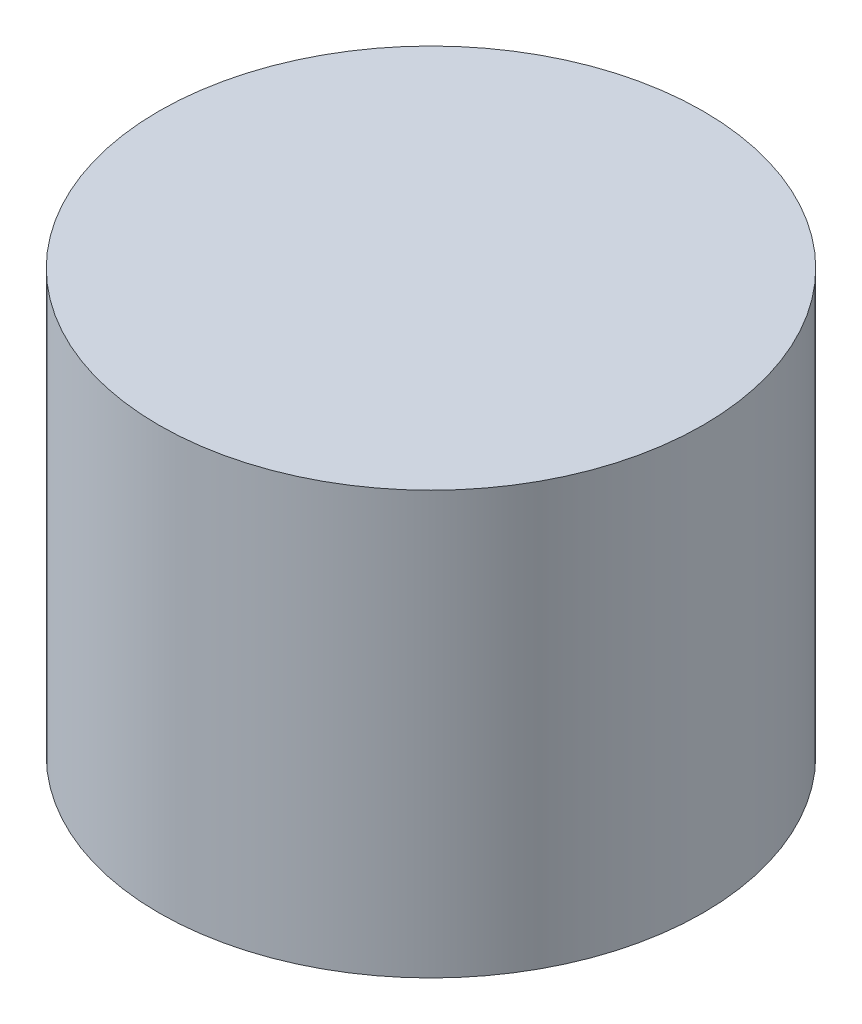
ISO-10303-21;
HEADER;
FILE_DESCRIPTION(('STEP AP214'),'2;1');
FILE_NAME('part.step','',(''),(''),'','','');
FILE_SCHEMA(('AUTOMOTIVE_DESIGN { 1 0 10303 214 1 1 1 1 }'));
ENDSEC;
DATA;
#1=APPLICATION_CONTEXT('core data for automotive mechanical design processes');
#2=APPLICATION_PROTOCOL_DEFINITION('international standard','automotive_design',2000,#1);
#3=PRODUCT_CONTEXT('',#1,'mechanical');
#4=PRODUCT('Part','Part','',(#3));
#5=PRODUCT_RELATED_PRODUCT_CATEGORY('part','',(#4));
#6=PRODUCT_DEFINITION_FORMATION('','',#4);
#7=PRODUCT_DEFINITION_CONTEXT('part definition',#1,'design');
#8=PRODUCT_DEFINITION('design','',#6,#7);
#9=PRODUCT_DEFINITION_SHAPE('','',#8);
#10=(LENGTH_UNIT() NAMED_UNIT(*) SI_UNIT(.MILLI.,.METRE.));
#11=(NAMED_UNIT(*) PLANE_ANGLE_UNIT() SI_UNIT($,.RADIAN.));
#12=(NAMED_UNIT(*) SI_UNIT($,.STERADIAN.) SOLID_ANGLE_UNIT());
#13=UNCERTAINTY_MEASURE_WITH_UNIT(LENGTH_MEASURE(1.E-05),#10,'distance_accuracy_value','');
#14=(GEOMETRIC_REPRESENTATION_CONTEXT(3) GLOBAL_UNCERTAINTY_ASSIGNED_CONTEXT((#13)) GLOBAL_UNIT_ASSIGNED_CONTEXT((#10,
#11,#12)) REPRESENTATION_CONTEXT('',''));
#15=CARTESIAN_POINT('',(0.,0.,0.));
#16=DIRECTION('',(0.,0.,1.));
#17=DIRECTION('',(1.,0.,0.));
#18=AXIS2_PLACEMENT_3D('',#15,#16,#17);
#19=CARTESIAN_POINT('',(0.,0.,0.));
#20=DIRECTION('',(0.,1.,0.));
#21=DIRECTION('',(0.,0.,1.));
#22=AXIS2_PLACEMENT_3D('',#19,#20,#21);
#23=CYLINDRICAL_SURFACE('',#22,1.9);
#24=CARTESIAN_POINT('',(0.,0.,0.));
#25=DIRECTION('',(0.,1.,0.));
#26=DIRECTION('',(0.,0.,1.));
#27=AXIS2_PLACEMENT_3D('',#24,#25,#26);
#28=CIRCLE('',#27,1.9);
#29=CARTESIAN_POINT('',(0.,0.,1.9));
#30=VERTEX_POINT('',#29);
#31=EDGE_CURVE('E10',#30,#30,#28,.T.);
#32=ORIENTED_EDGE('',*,*,#31,.T.);
#33=EDGE_LOOP('',(#32));
#34=FACE_BOUND('',#33,.T.);
#35=CARTESIAN_POINT('',(0.,2.95,0.));
#36=DIRECTION('',(0.,1.,0.));
#37=DIRECTION('',(0.,0.,1.));
#38=AXIS2_PLACEMENT_3D('',#35,#36,#37);
#39=CIRCLE('',#38,1.9);
#40=CARTESIAN_POINT('',(0.,2.95,1.9));
#41=VERTEX_POINT('',#40);
#42=EDGE_CURVE('E41',#41,#41,#39,.T.);
#43=ORIENTED_EDGE('',*,*,#42,.F.);
#44=EDGE_LOOP('',(#43));
#45=FACE_BOUND('',#44,.T.);
#46=ADVANCED_FACE('F35',(#34,#45),#23,.T.);
#47=CARTESIAN_POINT('',(1.9,0.,0.));
#48=DIRECTION('',(0.,-1.,0.));
#49=DIRECTION('',(0.,0.,-1.));
#50=AXIS2_PLACEMENT_3D('',#47,#48,#49);
#51=PLANE('',#50);
#52=ORIENTED_EDGE('',*,*,#31,.F.);
#53=EDGE_LOOP('',(#52));
#54=FACE_BOUND('',#53,.T.);
#55=ADVANCED_FACE('F50',(#54),#51,.T.);
#56=CARTESIAN_POINT('',(0.,2.95,0.));
#57=DIRECTION('',(0.,1.,0.));
#58=DIRECTION('',(0.,0.,1.));
#59=AXIS2_PLACEMENT_3D('',#56,#57,#58);
#60=PLANE('',#59);
#61=ORIENTED_EDGE('',*,*,#42,.T.);
#62=EDGE_LOOP('',(#61));
#63=FACE_BOUND('',#62,.T.);
#64=ADVANCED_FACE('F47',(#63),#60,.T.);
#65=CLOSED_SHELL('',(#46,#55,#64));
#66=MANIFOLD_SOLID_BREP('B2',#65);
#67=ADVANCED_BREP_SHAPE_REPRESENTATION('',(#18,#66),#14);
#68=SHAPE_DEFINITION_REPRESENTATION(#9,#67);
ENDSEC;
END-ISO-10303-21;
